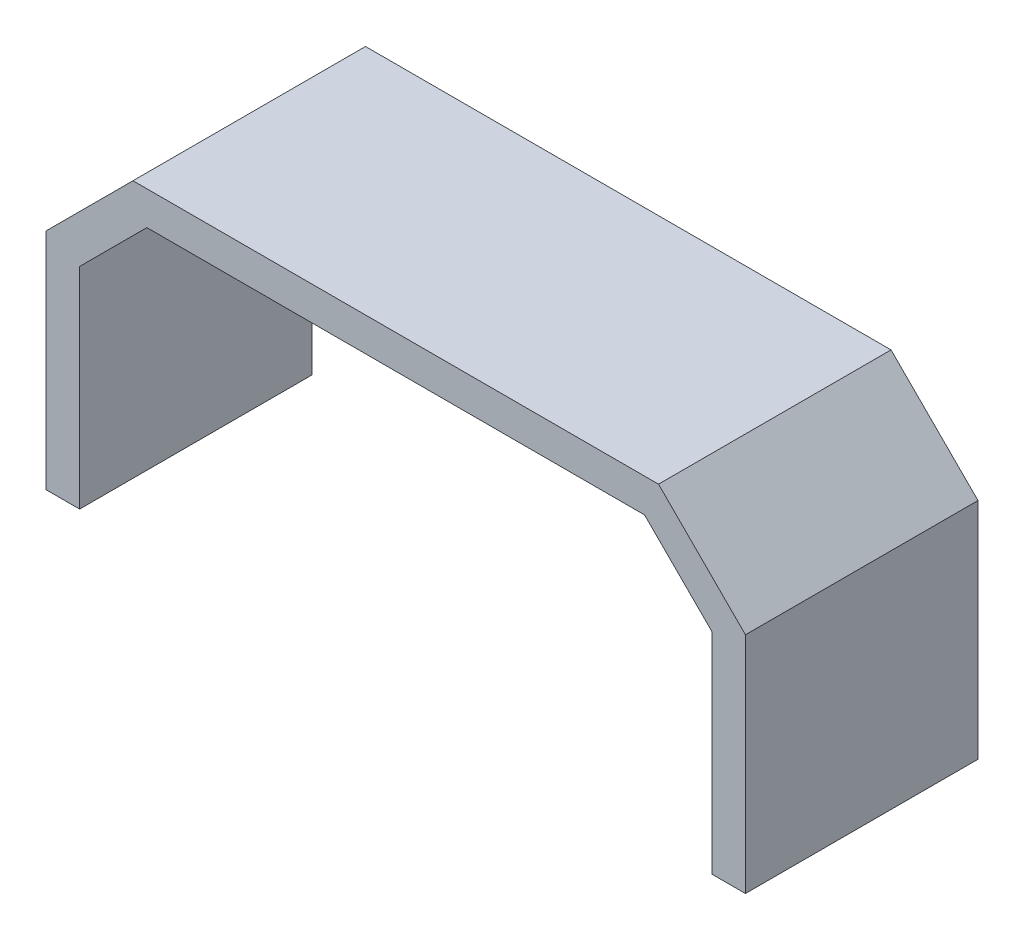
ISO-10303-21;
HEADER;
FILE_DESCRIPTION(('STEP AP214'),'2;1');
FILE_NAME('part.step','',(''),(''),'','','');
FILE_SCHEMA(('AUTOMOTIVE_DESIGN { 1 0 10303 214 1 1 1 1 }'));
ENDSEC;
DATA;
#1=APPLICATION_CONTEXT('core data for automotive mechanical design processes');
#2=APPLICATION_PROTOCOL_DEFINITION('international standard','automotive_design',2000,#1);
#3=PRODUCT_CONTEXT('',#1,'mechanical');
#4=PRODUCT('Part','Part','',(#3));
#5=PRODUCT_RELATED_PRODUCT_CATEGORY('part','',(#4));
#6=PRODUCT_DEFINITION_FORMATION('','',#4);
#7=PRODUCT_DEFINITION_CONTEXT('part definition',#1,'design');
#8=PRODUCT_DEFINITION('design','',#6,#7);
#9=PRODUCT_DEFINITION_SHAPE('','',#8);
#10=(LENGTH_UNIT() NAMED_UNIT(*) SI_UNIT(.MILLI.,.METRE.));
#11=(NAMED_UNIT(*) PLANE_ANGLE_UNIT() SI_UNIT($,.RADIAN.));
#12=(NAMED_UNIT(*) SI_UNIT($,.STERADIAN.) SOLID_ANGLE_UNIT());
#13=UNCERTAINTY_MEASURE_WITH_UNIT(LENGTH_MEASURE(1.E-05),#10,'distance_accuracy_value','');
#14=(GEOMETRIC_REPRESENTATION_CONTEXT(3) GLOBAL_UNCERTAINTY_ASSIGNED_CONTEXT((#13)) GLOBAL_UNIT_ASSIGNED_CONTEXT((#10,
#11,#12)) REPRESENTATION_CONTEXT('',''));
#15=CARTESIAN_POINT('',(0.,0.,0.));
#16=DIRECTION('',(0.,0.,1.));
#17=DIRECTION('',(1.,0.,0.));
#18=AXIS2_PLACEMENT_3D('',#15,#16,#17);
#19=CARTESIAN_POINT('',(-52.,0.,34.575));
#20=DIRECTION('',(0.,1.,0.));
#21=DIRECTION('',(-1.,0.,0.));
#22=AXIS2_PLACEMENT_3D('',#19,#20,#21);
#23=PLANE('',#22);
#24=DIRECTION('',(1.,0.,0.));
#25=VECTOR('',#24,1.);
#26=CARTESIAN_POINT('',(-52.,0.,0.));
#27=LINE('',#26,#25);
#28=CARTESIAN_POINT('',(-52.,0.,0.));
#29=VERTEX_POINT('',#28);
#30=CARTESIAN_POINT('',(-47.,0.,0.));
#31=VERTEX_POINT('',#30);
#32=EDGE_CURVE('E155',#29,#31,#27,.T.);
#33=ORIENTED_EDGE('',*,*,#32,.T.);
#34=DIRECTION('',(0.,0.,-1.));
#35=VECTOR('',#34,1.);
#36=CARTESIAN_POINT('',(-47.,0.,34.575));
#37=LINE('',#36,#35);
#38=CARTESIAN_POINT('',(-47.,0.,34.575));
#39=VERTEX_POINT('',#38);
#40=EDGE_CURVE('E11',#39,#31,#37,.T.);
#41=ORIENTED_EDGE('',*,*,#40,.F.);
#42=DIRECTION('',(1.,0.,0.));
#43=VECTOR('',#42,1.);
#44=CARTESIAN_POINT('',(-52.,0.,34.575));
#45=LINE('',#44,#43);
#46=CARTESIAN_POINT('',(-52.,0.,34.575));
#47=VERTEX_POINT('',#46);
#48=EDGE_CURVE('E177',#47,#39,#45,.T.);
#49=ORIENTED_EDGE('',*,*,#48,.F.);
#50=DIRECTION('',(0.,0.,-1.));
#51=VECTOR('',#50,1.);
#52=CARTESIAN_POINT('',(-52.,0.,34.575));
#53=LINE('',#52,#51);
#54=EDGE_CURVE('E151',#47,#29,#53,.T.);
#55=ORIENTED_EDGE('',*,*,#54,.T.);
#56=EDGE_LOOP('',(#33,#41,#49,#55));
#57=FACE_BOUND('',#56,.T.);
#58=ADVANCED_FACE('F35',(#57),#23,.F.);
#59=CARTESIAN_POINT('',(-47.,0.,34.575));
#60=DIRECTION('',(-1.,0.,0.));
#61=DIRECTION('',(0.,0.,1.));
#62=AXIS2_PLACEMENT_3D('',#59,#60,#61);
#63=PLANE('',#62);
#64=DIRECTION('',(0.,1.,0.));
#65=VECTOR('',#64,1.);
#66=CARTESIAN_POINT('',(-47.,0.,0.));
#67=LINE('',#66,#65);
#68=CARTESIAN_POINT('',(-47.,31.2489321881345,0.));
#69=VERTEX_POINT('',#68);
#70=EDGE_CURVE('E158',#31,#69,#67,.T.);
#71=ORIENTED_EDGE('',*,*,#70,.T.);
#72=DIRECTION('',(0.,0.,-1.));
#73=VECTOR('',#72,1.);
#74=CARTESIAN_POINT('',(-47.,31.2489321881345,34.575));
#75=LINE('',#74,#73);
#76=CARTESIAN_POINT('',(-47.,31.2489321881345,34.575));
#77=VERTEX_POINT('',#76);
#78=EDGE_CURVE('E43',#77,#69,#75,.T.);
#79=ORIENTED_EDGE('',*,*,#78,.F.);
#80=DIRECTION('',(0.,1.,0.));
#81=VECTOR('',#80,1.);
#82=CARTESIAN_POINT('',(-47.,0.,34.575));
#83=LINE('',#82,#81);
#84=EDGE_CURVE('E106',#39,#77,#83,.T.);
#85=ORIENTED_EDGE('',*,*,#84,.F.);
#86=ORIENTED_EDGE('',*,*,#40,.T.);
#87=EDGE_LOOP('',(#71,#79,#85,#86));
#88=FACE_BOUND('',#87,.T.);
#89=ADVANCED_FACE('F255',(#88),#63,.F.);
#90=CARTESIAN_POINT('',(-47.,31.2489321881345,34.575));
#91=DIRECTION('',(-0.707106781186549,0.707106781186546,0.));
#92=DIRECTION('',(-0.707106781186546,-0.707106781186549,0.));
#93=AXIS2_PLACEMENT_3D('',#90,#91,#92);
#94=PLANE('',#93);
#95=DIRECTION('',(0.707106781186546,0.707106781186549,0.));
#96=VECTOR('',#95,1.);
#97=CARTESIAN_POINT('',(-47.,31.2489321881345,0.));
#98=LINE('',#97,#96);
#99=CARTESIAN_POINT('',(-37.,41.2489321881345,0.));
#100=VERTEX_POINT('',#99);
#101=EDGE_CURVE('E160',#69,#100,#98,.T.);
#102=ORIENTED_EDGE('',*,*,#101,.T.);
#103=DIRECTION('',(0.,0.,-1.));
#104=VECTOR('',#103,1.);
#105=CARTESIAN_POINT('',(-37.,41.2489321881345,34.575));
#106=LINE('',#105,#104);
#107=CARTESIAN_POINT('',(-37.,41.2489321881345,34.575));
#108=VERTEX_POINT('',#107);
#109=EDGE_CURVE('E196',#108,#100,#106,.T.);
#110=ORIENTED_EDGE('',*,*,#109,.F.);
#111=DIRECTION('',(0.707106781186546,0.707106781186549,0.));
#112=VECTOR('',#111,1.);
#113=CARTESIAN_POINT('',(-47.,31.2489321881345,34.575));
#114=LINE('',#113,#112);
#115=EDGE_CURVE('E204',#77,#108,#114,.T.);
#116=ORIENTED_EDGE('',*,*,#115,.F.);
#117=ORIENTED_EDGE('',*,*,#78,.T.);
#118=EDGE_LOOP('',(#102,#110,#116,#117));
#119=FACE_BOUND('',#118,.T.);
#120=ADVANCED_FACE('F202',(#119),#94,.F.);
#121=CARTESIAN_POINT('',(-37.,41.2489321881345,34.575));
#122=DIRECTION('',(0.,1.,0.));
#123=DIRECTION('',(-1.,0.,0.));
#124=AXIS2_PLACEMENT_3D('',#121,#122,#123);
#125=PLANE('',#124);
#126=DIRECTION('',(1.,0.,0.));
#127=VECTOR('',#126,1.);
#128=CARTESIAN_POINT('',(-37.,41.2489321881345,0.));
#129=LINE('',#128,#127);
#130=CARTESIAN_POINT('',(37.,41.2489321881345,0.));
#131=VERTEX_POINT('',#130);
#132=EDGE_CURVE('E162',#100,#131,#129,.T.);
#133=ORIENTED_EDGE('',*,*,#132,.T.);
#134=DIRECTION('',(0.,0.,-1.));
#135=VECTOR('',#134,1.);
#136=CARTESIAN_POINT('',(37.,41.2489321881345,34.575));
#137=LINE('',#136,#135);
#138=CARTESIAN_POINT('',(37.,41.2489321881345,34.575));
#139=VERTEX_POINT('',#138);
#140=EDGE_CURVE('E193',#139,#131,#137,.T.);
#141=ORIENTED_EDGE('',*,*,#140,.F.);
#142=DIRECTION('',(1.,0.,0.));
#143=VECTOR('',#142,1.);
#144=CARTESIAN_POINT('',(-37.,41.2489321881345,34.575));
#145=LINE('',#144,#143);
#146=EDGE_CURVE('E222',#108,#139,#145,.T.);
#147=ORIENTED_EDGE('',*,*,#146,.F.);
#148=ORIENTED_EDGE('',*,*,#109,.T.);
#149=EDGE_LOOP('',(#133,#141,#147,#148));
#150=FACE_BOUND('',#149,.T.);
#151=ADVANCED_FACE('F213',(#150),#125,.F.);
#152=CARTESIAN_POINT('',(37.,41.2489321881345,34.575));
#153=DIRECTION('',(0.707106781186546,0.707106781186549,0.));
#154=DIRECTION('',(-0.707106781186549,0.707106781186546,0.));
#155=AXIS2_PLACEMENT_3D('',#152,#153,#154);
#156=PLANE('',#155);
#157=DIRECTION('',(0.707106781186549,-0.707106781186546,0.));
#158=VECTOR('',#157,1.);
#159=CARTESIAN_POINT('',(37.,41.2489321881345,0.));
#160=LINE('',#159,#158);
#161=CARTESIAN_POINT('',(47.,31.2489321881345,0.));
#162=VERTEX_POINT('',#161);
#163=EDGE_CURVE('E164',#131,#162,#160,.T.);
#164=ORIENTED_EDGE('',*,*,#163,.T.);
#165=DIRECTION('',(0.,0.,-1.));
#166=VECTOR('',#165,1.);
#167=CARTESIAN_POINT('',(47.,31.2489321881345,34.575));
#168=LINE('',#167,#166);
#169=CARTESIAN_POINT('',(47.,31.2489321881345,34.575));
#170=VERTEX_POINT('',#169);
#171=EDGE_CURVE('E190',#170,#162,#168,.T.);
#172=ORIENTED_EDGE('',*,*,#171,.F.);
#173=DIRECTION('',(0.707106781186549,-0.707106781186546,0.));
#174=VECTOR('',#173,1.);
#175=CARTESIAN_POINT('',(37.,41.2489321881345,34.575));
#176=LINE('',#175,#174);
#177=EDGE_CURVE('E219',#139,#170,#176,.T.);
#178=ORIENTED_EDGE('',*,*,#177,.F.);
#179=ORIENTED_EDGE('',*,*,#140,.T.);
#180=EDGE_LOOP('',(#164,#172,#178,#179));
#181=FACE_BOUND('',#180,.T.);
#182=ADVANCED_FACE('F217',(#181),#156,.F.);
#183=CARTESIAN_POINT('',(47.,31.2489321881345,34.575));
#184=DIRECTION('',(1.,0.,0.));
#185=DIRECTION('',(0.,0.,-1.));
#186=AXIS2_PLACEMENT_3D('',#183,#184,#185);
#187=PLANE('',#186);
#188=DIRECTION('',(0.,-1.,0.));
#189=VECTOR('',#188,1.);
#190=CARTESIAN_POINT('',(47.,31.2489321881345,0.));
#191=LINE('',#190,#189);
#192=CARTESIAN_POINT('',(47.,0.,0.));
#193=VERTEX_POINT('',#192);
#194=EDGE_CURVE('E166',#162,#193,#191,.T.);
#195=ORIENTED_EDGE('',*,*,#194,.T.);
#196=DIRECTION('',(0.,0.,-1.));
#197=VECTOR('',#196,1.);
#198=CARTESIAN_POINT('',(47.,0.,34.575));
#199=LINE('',#198,#197);
#200=CARTESIAN_POINT('',(47.,0.,34.575));
#201=VERTEX_POINT('',#200);
#202=EDGE_CURVE('E187',#201,#193,#199,.T.);
#203=ORIENTED_EDGE('',*,*,#202,.F.);
#204=DIRECTION('',(0.,-1.,0.));
#205=VECTOR('',#204,1.);
#206=CARTESIAN_POINT('',(47.,31.2489321881345,34.575));
#207=LINE('',#206,#205);
#208=EDGE_CURVE('E221',#170,#201,#207,.T.);
#209=ORIENTED_EDGE('',*,*,#208,.F.);
#210=ORIENTED_EDGE('',*,*,#171,.T.);
#211=EDGE_LOOP('',(#195,#203,#209,#210));
#212=FACE_BOUND('',#211,.T.);
#213=ADVANCED_FACE('F268',(#212),#187,.F.);
#214=CARTESIAN_POINT('',(47.,0.,34.575));
#215=DIRECTION('',(0.,1.,0.));
#216=DIRECTION('',(-1.,0.,0.));
#217=AXIS2_PLACEMENT_3D('',#214,#215,#216);
#218=PLANE('',#217);
#219=DIRECTION('',(1.,0.,0.));
#220=VECTOR('',#219,1.);
#221=CARTESIAN_POINT('',(47.,0.,0.));
#222=LINE('',#221,#220);
#223=CARTESIAN_POINT('',(52.,0.,0.));
#224=VERTEX_POINT('',#223);
#225=EDGE_CURVE('E168',#193,#224,#222,.T.);
#226=ORIENTED_EDGE('',*,*,#225,.T.);
#227=DIRECTION('',(0.,0.,-1.));
#228=VECTOR('',#227,1.);
#229=CARTESIAN_POINT('',(52.,0.,34.575));
#230=LINE('',#229,#228);
#231=CARTESIAN_POINT('',(52.,0.,34.575));
#232=VERTEX_POINT('',#231);
#233=EDGE_CURVE('E184',#232,#224,#230,.T.);
#234=ORIENTED_EDGE('',*,*,#233,.F.);
#235=DIRECTION('',(1.,0.,0.));
#236=VECTOR('',#235,1.);
#237=CARTESIAN_POINT('',(47.,0.,34.575));
#238=LINE('',#237,#236);
#239=EDGE_CURVE('E224',#201,#232,#238,.T.);
#240=ORIENTED_EDGE('',*,*,#239,.F.);
#241=ORIENTED_EDGE('',*,*,#202,.T.);
#242=EDGE_LOOP('',(#226,#234,#240,#241));
#243=FACE_BOUND('',#242,.T.);
#244=ADVANCED_FACE('F271',(#243),#218,.F.);
#245=CARTESIAN_POINT('',(52.,33.32,34.575));
#246=DIRECTION('',(-1.,0.,0.));
#247=DIRECTION('',(0.,0.,1.));
#248=AXIS2_PLACEMENT_3D('',#245,#246,#247);
#249=PLANE('',#248);
#250=DIRECTION('',(0.,1.,0.));
#251=VECTOR('',#250,1.);
#252=CARTESIAN_POINT('',(52.,33.32,0.));
#253=LINE('',#252,#251);
#254=CARTESIAN_POINT('',(52.,33.32,0.));
#255=VERTEX_POINT('',#254);
#256=EDGE_CURVE('E170',#224,#255,#253,.T.);
#257=ORIENTED_EDGE('',*,*,#256,.T.);
#258=DIRECTION('',(0.,0.,-1.));
#259=VECTOR('',#258,1.);
#260=CARTESIAN_POINT('',(52.,33.32,34.575));
#261=LINE('',#260,#259);
#262=CARTESIAN_POINT('',(52.,33.32,34.575));
#263=VERTEX_POINT('',#262);
#264=EDGE_CURVE('E181',#263,#255,#261,.T.);
#265=ORIENTED_EDGE('',*,*,#264,.F.);
#266=DIRECTION('',(0.,1.,0.));
#267=VECTOR('',#266,1.);
#268=CARTESIAN_POINT('',(52.,33.32,34.575));
#269=LINE('',#268,#267);
#270=EDGE_CURVE('E230',#232,#263,#269,.T.);
#271=ORIENTED_EDGE('',*,*,#270,.F.);
#272=ORIENTED_EDGE('',*,*,#233,.T.);
#273=EDGE_LOOP('',(#257,#265,#271,#272));
#274=FACE_BOUND('',#273,.T.);
#275=ADVANCED_FACE('F236',(#274),#249,.F.);
#276=CARTESIAN_POINT('',(39.0710678118655,46.2489321881345,34.575));
#277=DIRECTION('',(-0.707106781186546,-0.707106781186549,0.));
#278=DIRECTION('',(0.707106781186549,-0.707106781186546,0.));
#279=AXIS2_PLACEMENT_3D('',#276,#277,#278);
#280=PLANE('',#279);
#281=DIRECTION('',(-0.707106781186549,0.707106781186546,0.));
#282=VECTOR('',#281,1.);
#283=CARTESIAN_POINT('',(39.0710678118655,46.2489321881345,0.));
#284=LINE('',#283,#282);
#285=CARTESIAN_POINT('',(39.0710678118655,46.2489321881345,0.));
#286=VERTEX_POINT('',#285);
#287=EDGE_CURVE('E172',#255,#286,#284,.T.);
#288=ORIENTED_EDGE('',*,*,#287,.T.);
#289=DIRECTION('',(0.,0.,-1.));
#290=VECTOR('',#289,1.);
#291=CARTESIAN_POINT('',(39.0710678118655,46.2489321881345,34.575));
#292=LINE('',#291,#290);
#293=CARTESIAN_POINT('',(39.0710678118655,46.2489321881345,34.575));
#294=VERTEX_POINT('',#293);
#295=EDGE_CURVE('E146',#294,#286,#292,.T.);
#296=ORIENTED_EDGE('',*,*,#295,.F.);
#297=DIRECTION('',(-0.707106781186549,0.707106781186546,0.));
#298=VECTOR('',#297,1.);
#299=CARTESIAN_POINT('',(39.0710678118655,46.2489321881345,34.575));
#300=LINE('',#299,#298);
#301=EDGE_CURVE('E137',#263,#294,#300,.T.);
#302=ORIENTED_EDGE('',*,*,#301,.F.);
#303=ORIENTED_EDGE('',*,*,#264,.T.);
#304=EDGE_LOOP('',(#288,#296,#302,#303));
#305=FACE_BOUND('',#304,.T.);
#306=ADVANCED_FACE('F240',(#305),#280,.F.);
#307=CARTESIAN_POINT('',(-39.0710678118655,46.2489321881345,34.575));
#308=DIRECTION('',(0.,-1.,0.));
#309=DIRECTION('',(0.,0.,-1.));
#310=AXIS2_PLACEMENT_3D('',#307,#308,#309);
#311=PLANE('',#310);
#312=DIRECTION('',(-1.,0.,0.));
#313=VECTOR('',#312,1.);
#314=CARTESIAN_POINT('',(-39.0710678118655,46.2489321881345,0.));
#315=LINE('',#314,#313);
#316=CARTESIAN_POINT('',(-39.0710678118655,46.2489321881345,0.));
#317=VERTEX_POINT('',#316);
#318=EDGE_CURVE('E145',#286,#317,#315,.T.);
#319=ORIENTED_EDGE('',*,*,#318,.T.);
#320=DIRECTION('',(0.,0.,-1.));
#321=VECTOR('',#320,1.);
#322=CARTESIAN_POINT('',(-39.0710678118655,46.2489321881345,34.575));
#323=LINE('',#322,#321);
#324=CARTESIAN_POINT('',(-39.0710678118655,46.2489321881345,34.575));
#325=VERTEX_POINT('',#324);
#326=EDGE_CURVE('E142',#325,#317,#323,.T.);
#327=ORIENTED_EDGE('',*,*,#326,.F.);
#328=DIRECTION('',(-1.,0.,0.));
#329=VECTOR('',#328,1.);
#330=CARTESIAN_POINT('',(-39.0710678118655,46.2489321881345,34.575));
#331=LINE('',#330,#329);
#332=EDGE_CURVE('E131',#294,#325,#331,.T.);
#333=ORIENTED_EDGE('',*,*,#332,.F.);
#334=ORIENTED_EDGE('',*,*,#295,.T.);
#335=EDGE_LOOP('',(#319,#327,#333,#334));
#336=FACE_BOUND('',#335,.T.);
#337=ADVANCED_FACE('F143',(#336),#311,.F.);
#338=CARTESIAN_POINT('',(-52.,33.32,34.575));
#339=DIRECTION('',(0.707106781186549,-0.707106781186546,0.));
#340=DIRECTION('',(0.707106781186546,0.707106781186549,0.));
#341=AXIS2_PLACEMENT_3D('',#338,#339,#340);
#342=PLANE('',#341);
#343=DIRECTION('',(-0.707106781186546,-0.707106781186549,0.));
#344=VECTOR('',#343,1.);
#345=CARTESIAN_POINT('',(-52.,33.32,0.));
#346=LINE('',#345,#344);
#347=CARTESIAN_POINT('',(-52.,33.32,0.));
#348=VERTEX_POINT('',#347);
#349=EDGE_CURVE('E92',#317,#348,#346,.T.);
#350=ORIENTED_EDGE('',*,*,#349,.T.);
#351=DIRECTION('',(0.,0.,-1.));
#352=VECTOR('',#351,1.);
#353=CARTESIAN_POINT('',(-52.,33.32,34.575));
#354=LINE('',#353,#352);
#355=CARTESIAN_POINT('',(-52.,33.32,34.575));
#356=VERTEX_POINT('',#355);
#357=EDGE_CURVE('E147',#356,#348,#354,.T.);
#358=ORIENTED_EDGE('',*,*,#357,.F.);
#359=DIRECTION('',(-0.707106781186546,-0.707106781186549,0.));
#360=VECTOR('',#359,1.);
#361=CARTESIAN_POINT('',(-52.,33.32,34.575));
#362=LINE('',#361,#360);
#363=EDGE_CURVE('E135',#325,#356,#362,.T.);
#364=ORIENTED_EDGE('',*,*,#363,.F.);
#365=ORIENTED_EDGE('',*,*,#326,.T.);
#366=EDGE_LOOP('',(#350,#358,#364,#365));
#367=FACE_BOUND('',#366,.T.);
#368=ADVANCED_FACE('F149',(#367),#342,.F.);
#369=CARTESIAN_POINT('',(-52.,0.,34.575));
#370=DIRECTION('',(1.,0.,0.));
#371=DIRECTION('',(0.,0.,-1.));
#372=AXIS2_PLACEMENT_3D('',#369,#370,#371);
#373=PLANE('',#372);
#374=DIRECTION('',(0.,-1.,0.));
#375=VECTOR('',#374,1.);
#376=CARTESIAN_POINT('',(-52.,0.,0.));
#377=LINE('',#376,#375);
#378=EDGE_CURVE('E98',#348,#29,#377,.T.);
#379=ORIENTED_EDGE('',*,*,#378,.T.);
#380=ORIENTED_EDGE('',*,*,#54,.F.);
#381=DIRECTION('',(0.,-1.,0.));
#382=VECTOR('',#381,1.);
#383=CARTESIAN_POINT('',(-52.,0.,34.575));
#384=LINE('',#383,#382);
#385=EDGE_CURVE('E51',#356,#47,#384,.T.);
#386=ORIENTED_EDGE('',*,*,#385,.F.);
#387=ORIENTED_EDGE('',*,*,#357,.T.);
#388=EDGE_LOOP('',(#379,#380,#386,#387));
#389=FACE_BOUND('',#388,.T.);
#390=ADVANCED_FACE('F244',(#389),#373,.F.);
#391=CARTESIAN_POINT('',(0.,0.,34.575));
#392=DIRECTION('',(0.,0.,1.));
#393=DIRECTION('',(1.,0.,0.));
#394=AXIS2_PLACEMENT_3D('',#391,#392,#393);
#395=PLANE('',#394);
#396=ORIENTED_EDGE('',*,*,#48,.T.);
#397=ORIENTED_EDGE('',*,*,#84,.T.);
#398=ORIENTED_EDGE('',*,*,#115,.T.);
#399=ORIENTED_EDGE('',*,*,#146,.T.);
#400=ORIENTED_EDGE('',*,*,#177,.T.);
#401=ORIENTED_EDGE('',*,*,#208,.T.);
#402=ORIENTED_EDGE('',*,*,#239,.T.);
#403=ORIENTED_EDGE('',*,*,#270,.T.);
#404=ORIENTED_EDGE('',*,*,#301,.T.);
#405=ORIENTED_EDGE('',*,*,#332,.T.);
#406=ORIENTED_EDGE('',*,*,#363,.T.);
#407=ORIENTED_EDGE('',*,*,#385,.T.);
#408=EDGE_LOOP('',(#396,#397,#398,#399,#400,#401,#402,#403,#404,#405,#406,#407));
#409=FACE_BOUND('',#408,.T.);
#410=ADVANCED_FACE('F133',(#409),#395,.T.);
#411=CARTESIAN_POINT('',(0.,0.,0.));
#412=DIRECTION('',(0.,0.,1.));
#413=DIRECTION('',(1.,0.,0.));
#414=AXIS2_PLACEMENT_3D('',#411,#412,#413);
#415=PLANE('',#414);
#416=ORIENTED_EDGE('',*,*,#32,.F.);
#417=ORIENTED_EDGE('',*,*,#378,.F.);
#418=ORIENTED_EDGE('',*,*,#349,.F.);
#419=ORIENTED_EDGE('',*,*,#318,.F.);
#420=ORIENTED_EDGE('',*,*,#287,.F.);
#421=ORIENTED_EDGE('',*,*,#256,.F.);
#422=ORIENTED_EDGE('',*,*,#225,.F.);
#423=ORIENTED_EDGE('',*,*,#194,.F.);
#424=ORIENTED_EDGE('',*,*,#163,.F.);
#425=ORIENTED_EDGE('',*,*,#132,.F.);
#426=ORIENTED_EDGE('',*,*,#101,.F.);
#427=ORIENTED_EDGE('',*,*,#70,.F.);
#428=EDGE_LOOP('',(#416,#417,#418,#419,#420,#421,#422,#423,#424,#425,#426,#427));
#429=FACE_BOUND('',#428,.T.);
#430=ADVANCED_FACE('F208',(#429),#415,.F.);
#431=CLOSED_SHELL('',(#58,#89,#120,#151,#182,#213,#244,#275,#306,#337,#368,#390,#410,#430));
#432=MANIFOLD_SOLID_BREP('B2',#431);
#433=ADVANCED_BREP_SHAPE_REPRESENTATION('',(#18,#432),#14);
#434=SHAPE_DEFINITION_REPRESENTATION(#9,#433);
ENDSEC;
END-ISO-10303-21;
